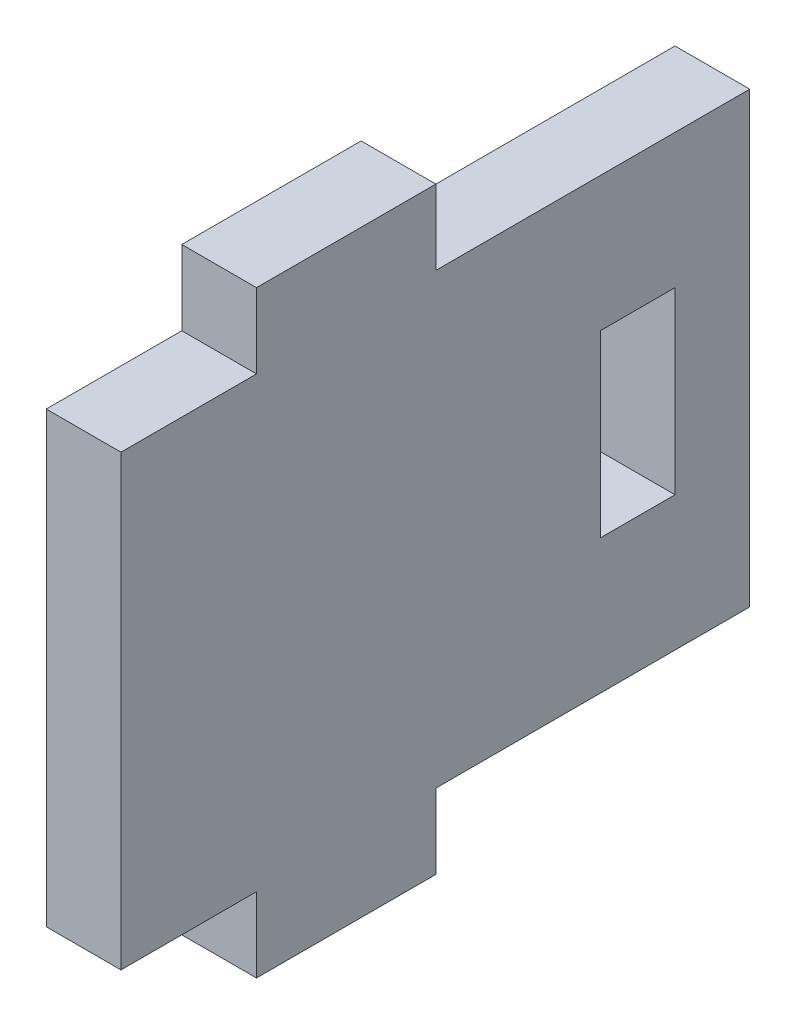
ISO-10303-21;
HEADER;
FILE_DESCRIPTION(('STEP AP214'),'2;1');
FILE_NAME('part.step','',(''),(''),'','','');
FILE_SCHEMA(('AUTOMOTIVE_DESIGN { 1 0 10303 214 1 1 1 1 }'));
ENDSEC;
DATA;
#1=APPLICATION_CONTEXT('core data for automotive mechanical design processes');
#2=APPLICATION_PROTOCOL_DEFINITION('international standard','automotive_design',2000,#1);
#3=PRODUCT_CONTEXT('',#1,'mechanical');
#4=PRODUCT('Part','Part','',(#3));
#5=PRODUCT_RELATED_PRODUCT_CATEGORY('part','',(#4));
#6=PRODUCT_DEFINITION_FORMATION('','',#4);
#7=PRODUCT_DEFINITION_CONTEXT('part definition',#1,'design');
#8=PRODUCT_DEFINITION('design','',#6,#7);
#9=PRODUCT_DEFINITION_SHAPE('','',#8);
#10=(LENGTH_UNIT() NAMED_UNIT(*) SI_UNIT(.MILLI.,.METRE.));
#11=(NAMED_UNIT(*) PLANE_ANGLE_UNIT() SI_UNIT($,.RADIAN.));
#12=(NAMED_UNIT(*) SI_UNIT($,.STERADIAN.) SOLID_ANGLE_UNIT());
#13=UNCERTAINTY_MEASURE_WITH_UNIT(LENGTH_MEASURE(1.E-05),#10,'distance_accuracy_value','');
#14=(GEOMETRIC_REPRESENTATION_CONTEXT(3) GLOBAL_UNCERTAINTY_ASSIGNED_CONTEXT((#13)) GLOBAL_UNIT_ASSIGNED_CONTEXT((#10,
#11,#12)) REPRESENTATION_CONTEXT('',''));
#15=CARTESIAN_POINT('',(0.,0.,0.));
#16=DIRECTION('',(0.,0.,1.));
#17=DIRECTION('',(1.,0.,0.));
#18=AXIS2_PLACEMENT_3D('',#15,#16,#17);
#19=CARTESIAN_POINT('',(5.,0.,0.));
#20=DIRECTION('',(1.,0.,0.));
#21=DIRECTION('',(0.,0.,-1.));
#22=AXIS2_PLACEMENT_3D('',#19,#20,#21);
#23=PLANE('',#22);
#24=DIRECTION('',(0.,-1.,0.));
#25=VECTOR('',#24,1.);
#26=CARTESIAN_POINT('',(5.,15.,0.));
#27=LINE('',#26,#25);
#28=CARTESIAN_POINT('',(5.,15.,0.));
#29=VERTEX_POINT('',#28);
#30=CARTESIAN_POINT('',(5.,-15.,0.));
#31=VERTEX_POINT('',#30);
#32=EDGE_CURVE('E184',#29,#31,#27,.T.);
#33=ORIENTED_EDGE('',*,*,#32,.T.);
#34=DIRECTION('',(0.,0.,-1.));
#35=VECTOR('',#34,1.);
#36=CARTESIAN_POINT('',(5.,-15.,0.));
#37=LINE('',#36,#35);
#38=CARTESIAN_POINT('',(5.,-14.9999999999999,-9.06638629861032));
#39=VERTEX_POINT('',#38);
#40=EDGE_CURVE('E187',#31,#39,#37,.T.);
#41=ORIENTED_EDGE('',*,*,#40,.T.);
#42=DIRECTION('',(0.,-1.,0.));
#43=VECTOR('',#42,1.);
#44=CARTESIAN_POINT('',(5.,-14.9999999999999,-9.06638629861032));
#45=LINE('',#44,#43);
#46=CARTESIAN_POINT('',(5.,-19.9999999999999,-9.06638629861032));
#47=VERTEX_POINT('',#46);
#48=EDGE_CURVE('E190',#39,#47,#45,.T.);
#49=ORIENTED_EDGE('',*,*,#48,.T.);
#50=DIRECTION('',(0.,0.,-1.));
#51=VECTOR('',#50,1.);
#52=CARTESIAN_POINT('',(5.,-19.9999999999999,-9.06638629861032));
#53=LINE('',#52,#51);
#54=CARTESIAN_POINT('',(5.,-19.9999999999999,-21.0663862986103));
#55=VERTEX_POINT('',#54);
#56=EDGE_CURVE('E192',#47,#55,#53,.T.);
#57=ORIENTED_EDGE('',*,*,#56,.T.);
#58=DIRECTION('',(0.,1.,0.));
#59=VECTOR('',#58,1.);
#60=CARTESIAN_POINT('',(5.,-19.9999999999999,-21.0663862986103));
#61=LINE('',#60,#59);
#62=CARTESIAN_POINT('',(5.,-14.9999999999999,-21.0663862986103));
#63=VERTEX_POINT('',#62);
#64=EDGE_CURVE('E194',#55,#63,#61,.T.);
#65=ORIENTED_EDGE('',*,*,#64,.T.);
#66=DIRECTION('',(0.,0.,-1.));
#67=VECTOR('',#66,1.);
#68=CARTESIAN_POINT('',(5.,-14.9999999999999,-21.0663862986103));
#69=LINE('',#68,#67);
#70=CARTESIAN_POINT('',(5.,-14.9999999999999,-42.0663862986103));
#71=VERTEX_POINT('',#70);
#72=EDGE_CURVE('E196',#63,#71,#69,.T.);
#73=ORIENTED_EDGE('',*,*,#72,.T.);
#74=DIRECTION('',(0.,1.,0.));
#75=VECTOR('',#74,1.);
#76=CARTESIAN_POINT('',(5.,15.,-42.0663862986103));
#77=LINE('',#76,#75);
#78=CARTESIAN_POINT('',(5.,15.,-42.0663862986103));
#79=VERTEX_POINT('',#78);
#80=EDGE_CURVE('E198',#71,#79,#77,.T.);
#81=ORIENTED_EDGE('',*,*,#80,.T.);
#82=DIRECTION('',(0.,0.,1.));
#83=VECTOR('',#82,1.);
#84=CARTESIAN_POINT('',(5.,15.,-21.0663862986103));
#85=LINE('',#84,#83);
#86=CARTESIAN_POINT('',(5.,15.,-21.0663862986103));
#87=VERTEX_POINT('',#86);
#88=EDGE_CURVE('E200',#79,#87,#85,.T.);
#89=ORIENTED_EDGE('',*,*,#88,.T.);
#90=DIRECTION('',(0.,1.,0.));
#91=VECTOR('',#90,1.);
#92=CARTESIAN_POINT('',(5.,20.,-21.0663862986103));
#93=LINE('',#92,#91);
#94=CARTESIAN_POINT('',(5.,20.,-21.0663862986103));
#95=VERTEX_POINT('',#94);
#96=EDGE_CURVE('E202',#87,#95,#93,.T.);
#97=ORIENTED_EDGE('',*,*,#96,.T.);
#98=DIRECTION('',(0.,0.,1.));
#99=VECTOR('',#98,1.);
#100=CARTESIAN_POINT('',(5.,20.,-9.06638629861032));
#101=LINE('',#100,#99);
#102=CARTESIAN_POINT('',(5.,20.,-9.06638629861032));
#103=VERTEX_POINT('',#102);
#104=EDGE_CURVE('E204',#95,#103,#101,.T.);
#105=ORIENTED_EDGE('',*,*,#104,.T.);
#106=DIRECTION('',(0.,-1.,0.));
#107=VECTOR('',#106,1.);
#108=CARTESIAN_POINT('',(5.,15.,-9.06638629861032));
#109=LINE('',#108,#107);
#110=CARTESIAN_POINT('',(5.,15.,-9.06638629861032));
#111=VERTEX_POINT('',#110);
#112=EDGE_CURVE('E206',#103,#111,#109,.T.);
#113=ORIENTED_EDGE('',*,*,#112,.T.);
#114=DIRECTION('',(0.,0.,1.));
#115=VECTOR('',#114,1.);
#116=CARTESIAN_POINT('',(5.,15.,0.));
#117=LINE('',#116,#115);
#118=EDGE_CURVE('E208',#111,#29,#117,.T.);
#119=ORIENTED_EDGE('',*,*,#118,.T.);
#120=EDGE_LOOP('',(#33,#41,#49,#57,#65,#73,#81,#89,#97,#105,#113,#119));
#121=FACE_BOUND('',#120,.T.);
#122=DIRECTION('',(0.,1.,0.));
#123=VECTOR('',#122,1.);
#124=CARTESIAN_POINT('',(5.,6.,-37.0663862986103));
#125=LINE('',#124,#123);
#126=CARTESIAN_POINT('',(5.,-5.99999999999994,-37.0663862986103));
#127=VERTEX_POINT('',#126);
#128=CARTESIAN_POINT('',(5.,6.,-37.0663862986103));
#129=VERTEX_POINT('',#128);
#130=EDGE_CURVE('E156',#127,#129,#125,.T.);
#131=ORIENTED_EDGE('',*,*,#130,.F.);
#132=DIRECTION('',(0.,0.,-1.));
#133=VECTOR('',#132,1.);
#134=CARTESIAN_POINT('',(5.,-5.99999999999994,-32.0663862986103));
#135=LINE('',#134,#133);
#136=CARTESIAN_POINT('',(5.,-5.99999999999994,-32.0663862986103));
#137=VERTEX_POINT('',#136);
#138=EDGE_CURVE('E148',#137,#127,#135,.T.);
#139=ORIENTED_EDGE('',*,*,#138,.F.);
#140=DIRECTION('',(0.,-1.,0.));
#141=VECTOR('',#140,1.);
#142=CARTESIAN_POINT('',(5.,6.,-32.0663862986103));
#143=LINE('',#142,#141);
#144=CARTESIAN_POINT('',(5.,6.,-32.0663862986103));
#145=VERTEX_POINT('',#144);
#146=EDGE_CURVE('E170',#145,#137,#143,.T.);
#147=ORIENTED_EDGE('',*,*,#146,.F.);
#148=DIRECTION('',(0.,0.,1.));
#149=VECTOR('',#148,1.);
#150=CARTESIAN_POINT('',(5.,6.,-32.0663862986103));
#151=LINE('',#150,#149);
#152=EDGE_CURVE('E168',#129,#145,#151,.T.);
#153=ORIENTED_EDGE('',*,*,#152,.F.);
#154=EDGE_LOOP('',(#131,#139,#147,#153));
#155=FACE_BOUND('',#154,.T.);
#156=ADVANCED_FACE('F35',(#121,#155),#23,.T.);
#157=CARTESIAN_POINT('',(0.,0.,0.));
#158=DIRECTION('',(1.,0.,0.));
#159=DIRECTION('',(0.,0.,-1.));
#160=AXIS2_PLACEMENT_3D('',#157,#158,#159);
#161=PLANE('',#160);
#162=DIRECTION('',(0.,-1.,0.));
#163=VECTOR('',#162,1.);
#164=CARTESIAN_POINT('',(0.,15.,0.));
#165=LINE('',#164,#163);
#166=CARTESIAN_POINT('',(0.,15.,0.));
#167=VERTEX_POINT('',#166);
#168=CARTESIAN_POINT('',(0.,-15.,0.));
#169=VERTEX_POINT('',#168);
#170=EDGE_CURVE('E164',#167,#169,#165,.T.);
#171=ORIENTED_EDGE('',*,*,#170,.F.);
#172=DIRECTION('',(0.,0.,1.));
#173=VECTOR('',#172,1.);
#174=CARTESIAN_POINT('',(0.,15.,0.));
#175=LINE('',#174,#173);
#176=CARTESIAN_POINT('',(0.,15.,-9.06638629861032));
#177=VERTEX_POINT('',#176);
#178=EDGE_CURVE('E188',#177,#167,#175,.T.);
#179=ORIENTED_EDGE('',*,*,#178,.F.);
#180=DIRECTION('',(0.,-1.,0.));
#181=VECTOR('',#180,1.);
#182=CARTESIAN_POINT('',(0.,15.,-9.06638629861032));
#183=LINE('',#182,#181);
#184=CARTESIAN_POINT('',(0.,20.,-9.06638629861032));
#185=VERTEX_POINT('',#184);
#186=EDGE_CURVE('E231',#185,#177,#183,.T.);
#187=ORIENTED_EDGE('',*,*,#186,.F.);
#188=DIRECTION('',(0.,0.,1.));
#189=VECTOR('',#188,1.);
#190=CARTESIAN_POINT('',(0.,20.,-9.06638629861032));
#191=LINE('',#190,#189);
#192=CARTESIAN_POINT('',(0.,20.,-21.0663862986103));
#193=VERTEX_POINT('',#192);
#194=EDGE_CURVE('E229',#193,#185,#191,.T.);
#195=ORIENTED_EDGE('',*,*,#194,.F.);
#196=DIRECTION('',(0.,1.,0.));
#197=VECTOR('',#196,1.);
#198=CARTESIAN_POINT('',(0.,20.,-21.0663862986103));
#199=LINE('',#198,#197);
#200=CARTESIAN_POINT('',(0.,15.,-21.0663862986103));
#201=VERTEX_POINT('',#200);
#202=EDGE_CURVE('E227',#201,#193,#199,.T.);
#203=ORIENTED_EDGE('',*,*,#202,.F.);
#204=DIRECTION('',(0.,0.,1.));
#205=VECTOR('',#204,1.);
#206=CARTESIAN_POINT('',(0.,15.,-21.0663862986103));
#207=LINE('',#206,#205);
#208=CARTESIAN_POINT('',(0.,15.,-42.0663862986103));
#209=VERTEX_POINT('',#208);
#210=EDGE_CURVE('E225',#209,#201,#207,.T.);
#211=ORIENTED_EDGE('',*,*,#210,.F.);
#212=DIRECTION('',(0.,1.,0.));
#213=VECTOR('',#212,1.);
#214=CARTESIAN_POINT('',(0.,15.,-42.0663862986103));
#215=LINE('',#214,#213);
#216=CARTESIAN_POINT('',(0.,-14.9999999999999,-42.0663862986103));
#217=VERTEX_POINT('',#216);
#218=EDGE_CURVE('E223',#217,#209,#215,.T.);
#219=ORIENTED_EDGE('',*,*,#218,.F.);
#220=DIRECTION('',(0.,0.,-1.));
#221=VECTOR('',#220,1.);
#222=CARTESIAN_POINT('',(0.,-14.9999999999999,-21.0663862986103));
#223=LINE('',#222,#221);
#224=CARTESIAN_POINT('',(0.,-14.9999999999999,-21.0663862986103));
#225=VERTEX_POINT('',#224);
#226=EDGE_CURVE('E221',#225,#217,#223,.T.);
#227=ORIENTED_EDGE('',*,*,#226,.F.);
#228=DIRECTION('',(0.,1.,0.));
#229=VECTOR('',#228,1.);
#230=CARTESIAN_POINT('',(0.,-19.9999999999999,-21.0663862986103));
#231=LINE('',#230,#229);
#232=CARTESIAN_POINT('',(0.,-19.9999999999999,-21.0663862986103));
#233=VERTEX_POINT('',#232);
#234=EDGE_CURVE('E219',#233,#225,#231,.T.);
#235=ORIENTED_EDGE('',*,*,#234,.F.);
#236=DIRECTION('',(0.,0.,-1.));
#237=VECTOR('',#236,1.);
#238=CARTESIAN_POINT('',(0.,-19.9999999999999,-9.06638629861032));
#239=LINE('',#238,#237);
#240=CARTESIAN_POINT('',(0.,-19.9999999999999,-9.06638629861032));
#241=VERTEX_POINT('',#240);
#242=EDGE_CURVE('E217',#241,#233,#239,.T.);
#243=ORIENTED_EDGE('',*,*,#242,.F.);
#244=DIRECTION('',(0.,-1.,0.));
#245=VECTOR('',#244,1.);
#246=CARTESIAN_POINT('',(0.,-14.9999999999999,-9.06638629861032));
#247=LINE('',#246,#245);
#248=CARTESIAN_POINT('',(0.,-14.9999999999999,-9.06638629861032));
#249=VERTEX_POINT('',#248);
#250=EDGE_CURVE('E215',#249,#241,#247,.T.);
#251=ORIENTED_EDGE('',*,*,#250,.F.);
#252=DIRECTION('',(0.,0.,-1.));
#253=VECTOR('',#252,1.);
#254=CARTESIAN_POINT('',(0.,-15.,0.));
#255=LINE('',#254,#253);
#256=EDGE_CURVE('E213',#169,#249,#255,.T.);
#257=ORIENTED_EDGE('',*,*,#256,.F.);
#258=EDGE_LOOP('',(#171,#179,#187,#195,#203,#211,#219,#227,#235,#243,#251,#257));
#259=FACE_BOUND('',#258,.T.);
#260=DIRECTION('',(0.,0.,-1.));
#261=VECTOR('',#260,1.);
#262=CARTESIAN_POINT('',(0.,-5.99999999999994,-32.0663862986103));
#263=LINE('',#262,#261);
#264=CARTESIAN_POINT('',(0.,-5.99999999999994,-32.0663862986103));
#265=VERTEX_POINT('',#264);
#266=CARTESIAN_POINT('',(0.,-5.99999999999994,-37.0663862986103));
#267=VERTEX_POINT('',#266);
#268=EDGE_CURVE('E58',#265,#267,#263,.T.);
#269=ORIENTED_EDGE('',*,*,#268,.T.);
#270=DIRECTION('',(0.,1.,0.));
#271=VECTOR('',#270,1.);
#272=CARTESIAN_POINT('',(0.,6.,-37.0663862986103));
#273=LINE('',#272,#271);
#274=CARTESIAN_POINT('',(0.,6.,-37.0663862986103));
#275=VERTEX_POINT('',#274);
#276=EDGE_CURVE('E163',#267,#275,#273,.T.);
#277=ORIENTED_EDGE('',*,*,#276,.T.);
#278=DIRECTION('',(0.,0.,1.));
#279=VECTOR('',#278,1.);
#280=CARTESIAN_POINT('',(0.,6.,-32.0663862986103));
#281=LINE('',#280,#279);
#282=CARTESIAN_POINT('',(0.,6.,-32.0663862986103));
#283=VERTEX_POINT('',#282);
#284=EDGE_CURVE('E176',#275,#283,#281,.T.);
#285=ORIENTED_EDGE('',*,*,#284,.T.);
#286=DIRECTION('',(0.,-1.,0.));
#287=VECTOR('',#286,1.);
#288=CARTESIAN_POINT('',(0.,6.,-32.0663862986103));
#289=LINE('',#288,#287);
#290=EDGE_CURVE('E157',#283,#265,#289,.T.);
#291=ORIENTED_EDGE('',*,*,#290,.T.);
#292=EDGE_LOOP('',(#269,#277,#285,#291));
#293=FACE_BOUND('',#292,.T.);
#294=ADVANCED_FACE('F273',(#259,#293),#161,.F.);
#295=CARTESIAN_POINT('',(5.,15.,0.));
#296=DIRECTION('',(0.,0.,-1.));
#297=DIRECTION('',(-1.,0.,0.));
#298=AXIS2_PLACEMENT_3D('',#295,#296,#297);
#299=PLANE('',#298);
#300=ORIENTED_EDGE('',*,*,#170,.T.);
#301=DIRECTION('',(-1.,0.,0.));
#302=VECTOR('',#301,1.);
#303=CARTESIAN_POINT('',(5.,-15.,0.));
#304=LINE('',#303,#302);
#305=EDGE_CURVE('E11',#31,#169,#304,.T.);
#306=ORIENTED_EDGE('',*,*,#305,.F.);
#307=ORIENTED_EDGE('',*,*,#32,.F.);
#308=DIRECTION('',(-1.,0.,0.));
#309=VECTOR('',#308,1.);
#310=CARTESIAN_POINT('',(5.,15.,0.));
#311=LINE('',#310,#309);
#312=EDGE_CURVE('E210',#29,#167,#311,.T.);
#313=ORIENTED_EDGE('',*,*,#312,.T.);
#314=EDGE_LOOP('',(#300,#306,#307,#313));
#315=FACE_BOUND('',#314,.T.);
#316=ADVANCED_FACE('F37',(#315),#299,.F.);
#317=CARTESIAN_POINT('',(5.,-15.,0.));
#318=DIRECTION('',(0.,1.,0.));
#319=DIRECTION('',(0.,0.,1.));
#320=AXIS2_PLACEMENT_3D('',#317,#318,#319);
#321=PLANE('',#320);
#322=ORIENTED_EDGE('',*,*,#256,.T.);
#323=DIRECTION('',(-1.,0.,0.));
#324=VECTOR('',#323,1.);
#325=CARTESIAN_POINT('',(5.,-14.9999999999999,-9.06638629861032));
#326=LINE('',#325,#324);
#327=EDGE_CURVE('E43',#39,#249,#326,.T.);
#328=ORIENTED_EDGE('',*,*,#327,.F.);
#329=ORIENTED_EDGE('',*,*,#40,.F.);
#330=ORIENTED_EDGE('',*,*,#305,.T.);
#331=EDGE_LOOP('',(#322,#328,#329,#330));
#332=FACE_BOUND('',#331,.T.);
#333=ADVANCED_FACE('F290',(#332),#321,.F.);
#334=CARTESIAN_POINT('',(5.,-14.9999999999999,-9.06638629861032));
#335=DIRECTION('',(0.,0.,-1.));
#336=DIRECTION('',(-1.,0.,0.));
#337=AXIS2_PLACEMENT_3D('',#334,#335,#336);
#338=PLANE('',#337);
#339=ORIENTED_EDGE('',*,*,#250,.T.);
#340=DIRECTION('',(-1.,0.,0.));
#341=VECTOR('',#340,1.);
#342=CARTESIAN_POINT('',(5.,-19.9999999999999,-9.06638629861032));
#343=LINE('',#342,#341);
#344=EDGE_CURVE('E260',#47,#241,#343,.T.);
#345=ORIENTED_EDGE('',*,*,#344,.F.);
#346=ORIENTED_EDGE('',*,*,#48,.F.);
#347=ORIENTED_EDGE('',*,*,#327,.T.);
#348=EDGE_LOOP('',(#339,#345,#346,#347));
#349=FACE_BOUND('',#348,.T.);
#350=ADVANCED_FACE('F267',(#349),#338,.F.);
#351=CARTESIAN_POINT('',(5.,-19.9999999999999,-9.06638629861032));
#352=DIRECTION('',(0.,1.,0.));
#353=DIRECTION('',(0.,0.,1.));
#354=AXIS2_PLACEMENT_3D('',#351,#352,#353);
#355=PLANE('',#354);
#356=ORIENTED_EDGE('',*,*,#242,.T.);
#357=DIRECTION('',(-1.,0.,0.));
#358=VECTOR('',#357,1.);
#359=CARTESIAN_POINT('',(5.,-19.9999999999999,-21.0663862986103));
#360=LINE('',#359,#358);
#361=EDGE_CURVE('E257',#55,#233,#360,.T.);
#362=ORIENTED_EDGE('',*,*,#361,.F.);
#363=ORIENTED_EDGE('',*,*,#56,.F.);
#364=ORIENTED_EDGE('',*,*,#344,.T.);
#365=EDGE_LOOP('',(#356,#362,#363,#364));
#366=FACE_BOUND('',#365,.T.);
#367=ADVANCED_FACE('F279',(#366),#355,.F.);
#368=CARTESIAN_POINT('',(5.,-19.9999999999999,-21.0663862986103));
#369=DIRECTION('',(0.,0.,1.));
#370=DIRECTION('',(1.,0.,0.));
#371=AXIS2_PLACEMENT_3D('',#368,#369,#370);
#372=PLANE('',#371);
#373=ORIENTED_EDGE('',*,*,#234,.T.);
#374=DIRECTION('',(-1.,0.,0.));
#375=VECTOR('',#374,1.);
#376=CARTESIAN_POINT('',(5.,-14.9999999999999,-21.0663862986103));
#377=LINE('',#376,#375);
#378=EDGE_CURVE('E254',#63,#225,#377,.T.);
#379=ORIENTED_EDGE('',*,*,#378,.F.);
#380=ORIENTED_EDGE('',*,*,#64,.F.);
#381=ORIENTED_EDGE('',*,*,#361,.T.);
#382=EDGE_LOOP('',(#373,#379,#380,#381));
#383=FACE_BOUND('',#382,.T.);
#384=ADVANCED_FACE('F283',(#383),#372,.F.);
#385=CARTESIAN_POINT('',(5.,-14.9999999999999,-21.0663862986103));
#386=DIRECTION('',(0.,1.,0.));
#387=DIRECTION('',(0.,0.,1.));
#388=AXIS2_PLACEMENT_3D('',#385,#386,#387);
#389=PLANE('',#388);
#390=ORIENTED_EDGE('',*,*,#226,.T.);
#391=DIRECTION('',(-1.,0.,0.));
#392=VECTOR('',#391,1.);
#393=CARTESIAN_POINT('',(5.,-14.9999999999999,-42.0663862986103));
#394=LINE('',#393,#392);
#395=EDGE_CURVE('E251',#71,#217,#394,.T.);
#396=ORIENTED_EDGE('',*,*,#395,.F.);
#397=ORIENTED_EDGE('',*,*,#72,.F.);
#398=ORIENTED_EDGE('',*,*,#378,.T.);
#399=EDGE_LOOP('',(#390,#396,#397,#398));
#400=FACE_BOUND('',#399,.T.);
#401=ADVANCED_FACE('F323',(#400),#389,.F.);
#402=CARTESIAN_POINT('',(5.,15.,-42.0663862986103));
#403=DIRECTION('',(0.,0.,1.));
#404=DIRECTION('',(1.,0.,0.));
#405=AXIS2_PLACEMENT_3D('',#402,#403,#404);
#406=PLANE('',#405);
#407=ORIENTED_EDGE('',*,*,#218,.T.);
#408=DIRECTION('',(-1.,0.,0.));
#409=VECTOR('',#408,1.);
#410=CARTESIAN_POINT('',(5.,15.,-42.0663862986103));
#411=LINE('',#410,#409);
#412=EDGE_CURVE('E248',#79,#209,#411,.T.);
#413=ORIENTED_EDGE('',*,*,#412,.F.);
#414=ORIENTED_EDGE('',*,*,#80,.F.);
#415=ORIENTED_EDGE('',*,*,#395,.T.);
#416=EDGE_LOOP('',(#407,#413,#414,#415));
#417=FACE_BOUND('',#416,.T.);
#418=ADVANCED_FACE('F321',(#417),#406,.F.);
#419=CARTESIAN_POINT('',(5.,15.,-21.0663862986103));
#420=DIRECTION('',(0.,-1.,0.));
#421=DIRECTION('',(0.,0.,-1.));
#422=AXIS2_PLACEMENT_3D('',#419,#420,#421);
#423=PLANE('',#422);
#424=ORIENTED_EDGE('',*,*,#210,.T.);
#425=DIRECTION('',(-1.,0.,0.));
#426=VECTOR('',#425,1.);
#427=CARTESIAN_POINT('',(5.,15.,-21.0663862986103));
#428=LINE('',#427,#426);
#429=EDGE_CURVE('E245',#87,#201,#428,.T.);
#430=ORIENTED_EDGE('',*,*,#429,.F.);
#431=ORIENTED_EDGE('',*,*,#88,.F.);
#432=ORIENTED_EDGE('',*,*,#412,.T.);
#433=EDGE_LOOP('',(#424,#430,#431,#432));
#434=FACE_BOUND('',#433,.T.);
#435=ADVANCED_FACE('F317',(#434),#423,.F.);
#436=CARTESIAN_POINT('',(5.,20.,-21.0663862986103));
#437=DIRECTION('',(0.,0.,1.));
#438=DIRECTION('',(1.,0.,0.));
#439=AXIS2_PLACEMENT_3D('',#436,#437,#438);
#440=PLANE('',#439);
#441=ORIENTED_EDGE('',*,*,#202,.T.);
#442=DIRECTION('',(-1.,0.,0.));
#443=VECTOR('',#442,1.);
#444=CARTESIAN_POINT('',(5.,20.,-21.0663862986103));
#445=LINE('',#444,#443);
#446=EDGE_CURVE('E242',#95,#193,#445,.T.);
#447=ORIENTED_EDGE('',*,*,#446,.F.);
#448=ORIENTED_EDGE('',*,*,#96,.F.);
#449=ORIENTED_EDGE('',*,*,#429,.T.);
#450=EDGE_LOOP('',(#441,#447,#448,#449));
#451=FACE_BOUND('',#450,.T.);
#452=ADVANCED_FACE('F312',(#451),#440,.F.);
#453=CARTESIAN_POINT('',(5.,20.,-9.06638629861032));
#454=DIRECTION('',(0.,-1.,0.));
#455=DIRECTION('',(0.,0.,-1.));
#456=AXIS2_PLACEMENT_3D('',#453,#454,#455);
#457=PLANE('',#456);
#458=ORIENTED_EDGE('',*,*,#194,.T.);
#459=DIRECTION('',(-1.,0.,0.));
#460=VECTOR('',#459,1.);
#461=CARTESIAN_POINT('',(5.,20.,-9.06638629861032));
#462=LINE('',#461,#460);
#463=EDGE_CURVE('E239',#103,#185,#462,.T.);
#464=ORIENTED_EDGE('',*,*,#463,.F.);
#465=ORIENTED_EDGE('',*,*,#104,.F.);
#466=ORIENTED_EDGE('',*,*,#446,.T.);
#467=EDGE_LOOP('',(#458,#464,#465,#466));
#468=FACE_BOUND('',#467,.T.);
#469=ADVANCED_FACE('F306',(#468),#457,.F.);
#470=CARTESIAN_POINT('',(5.,15.,-9.06638629861032));
#471=DIRECTION('',(0.,0.,-1.));
#472=DIRECTION('',(-1.,0.,0.));
#473=AXIS2_PLACEMENT_3D('',#470,#471,#472);
#474=PLANE('',#473);
#475=ORIENTED_EDGE('',*,*,#186,.T.);
#476=DIRECTION('',(-1.,0.,0.));
#477=VECTOR('',#476,1.);
#478=CARTESIAN_POINT('',(5.,15.,-9.06638629861032));
#479=LINE('',#478,#477);
#480=EDGE_CURVE('E236',#111,#177,#479,.T.);
#481=ORIENTED_EDGE('',*,*,#480,.F.);
#482=ORIENTED_EDGE('',*,*,#112,.F.);
#483=ORIENTED_EDGE('',*,*,#463,.T.);
#484=EDGE_LOOP('',(#475,#481,#482,#483));
#485=FACE_BOUND('',#484,.T.);
#486=ADVANCED_FACE('F302',(#485),#474,.F.);
#487=CARTESIAN_POINT('',(5.,15.,0.));
#488=DIRECTION('',(0.,-1.,0.));
#489=DIRECTION('',(0.,0.,-1.));
#490=AXIS2_PLACEMENT_3D('',#487,#488,#489);
#491=PLANE('',#490);
#492=ORIENTED_EDGE('',*,*,#178,.T.);
#493=ORIENTED_EDGE('',*,*,#312,.F.);
#494=ORIENTED_EDGE('',*,*,#118,.F.);
#495=ORIENTED_EDGE('',*,*,#480,.T.);
#496=EDGE_LOOP('',(#492,#493,#494,#495));
#497=FACE_BOUND('',#496,.T.);
#498=ADVANCED_FACE('F297',(#497),#491,.F.);
#499=CARTESIAN_POINT('',(5.,-5.99999999999994,-32.0663862986103));
#500=DIRECTION('',(0.,1.,0.));
#501=DIRECTION('',(0.,0.,1.));
#502=AXIS2_PLACEMENT_3D('',#499,#500,#501);
#503=PLANE('',#502);
#504=ORIENTED_EDGE('',*,*,#268,.F.);
#505=DIRECTION('',(-1.,0.,0.));
#506=VECTOR('',#505,1.);
#507=CARTESIAN_POINT('',(5.,-5.99999999999994,-32.0663862986103));
#508=LINE('',#507,#506);
#509=EDGE_CURVE('E152',#137,#265,#508,.T.);
#510=ORIENTED_EDGE('',*,*,#509,.F.);
#511=ORIENTED_EDGE('',*,*,#138,.T.);
#512=DIRECTION('',(-1.,0.,0.));
#513=VECTOR('',#512,1.);
#514=CARTESIAN_POINT('',(5.,-5.99999999999994,-37.0663862986103));
#515=LINE('',#514,#513);
#516=EDGE_CURVE('E151',#127,#267,#515,.T.);
#517=ORIENTED_EDGE('',*,*,#516,.T.);
#518=EDGE_LOOP('',(#504,#510,#511,#517));
#519=FACE_BOUND('',#518,.T.);
#520=ADVANCED_FACE('F150',(#519),#503,.T.);
#521=CARTESIAN_POINT('',(5.,6.,-37.0663862986103));
#522=DIRECTION('',(0.,0.,1.));
#523=DIRECTION('',(1.,0.,0.));
#524=AXIS2_PLACEMENT_3D('',#521,#522,#523);
#525=PLANE('',#524);
#526=ORIENTED_EDGE('',*,*,#276,.F.);
#527=ORIENTED_EDGE('',*,*,#516,.F.);
#528=ORIENTED_EDGE('',*,*,#130,.T.);
#529=DIRECTION('',(-1.,0.,0.));
#530=VECTOR('',#529,1.);
#531=CARTESIAN_POINT('',(5.,6.,-37.0663862986103));
#532=LINE('',#531,#530);
#533=EDGE_CURVE('E165',#129,#275,#532,.T.);
#534=ORIENTED_EDGE('',*,*,#533,.T.);
#535=EDGE_LOOP('',(#526,#527,#528,#534));
#536=FACE_BOUND('',#535,.T.);
#537=ADVANCED_FACE('F160',(#536),#525,.T.);
#538=CARTESIAN_POINT('',(5.,6.,-32.0663862986103));
#539=DIRECTION('',(0.,-1.,0.));
#540=DIRECTION('',(0.,0.,-1.));
#541=AXIS2_PLACEMENT_3D('',#538,#539,#540);
#542=PLANE('',#541);
#543=ORIENTED_EDGE('',*,*,#284,.F.);
#544=ORIENTED_EDGE('',*,*,#533,.F.);
#545=ORIENTED_EDGE('',*,*,#152,.T.);
#546=DIRECTION('',(-1.,0.,0.));
#547=VECTOR('',#546,1.);
#548=CARTESIAN_POINT('',(5.,6.,-32.0663862986103));
#549=LINE('',#548,#547);
#550=EDGE_CURVE('E50',#145,#283,#549,.T.);
#551=ORIENTED_EDGE('',*,*,#550,.T.);
#552=EDGE_LOOP('',(#543,#544,#545,#551));
#553=FACE_BOUND('',#552,.T.);
#554=ADVANCED_FACE('F381',(#553),#542,.T.);
#555=CARTESIAN_POINT('',(5.,6.,-32.0663862986103));
#556=DIRECTION('',(0.,0.,-1.));
#557=DIRECTION('',(-1.,0.,0.));
#558=AXIS2_PLACEMENT_3D('',#555,#556,#557);
#559=PLANE('',#558);
#560=ORIENTED_EDGE('',*,*,#290,.F.);
#561=ORIENTED_EDGE('',*,*,#550,.F.);
#562=ORIENTED_EDGE('',*,*,#146,.T.);
#563=ORIENTED_EDGE('',*,*,#509,.T.);
#564=EDGE_LOOP('',(#560,#561,#562,#563));
#565=FACE_BOUND('',#564,.T.);
#566=ADVANCED_FACE('F387',(#565),#559,.T.);
#567=CLOSED_SHELL('',(#156,#294,#316,#333,#350,#367,#384,#401,#418,#435,#452,#469,#486,#498,
#520,#537,#554,#566));
#568=MANIFOLD_SOLID_BREP('B2',#567);
#569=ADVANCED_BREP_SHAPE_REPRESENTATION('',(#18,#568),#14);
#570=SHAPE_DEFINITION_REPRESENTATION(#9,#569);
ENDSEC;
END-ISO-10303-21;
